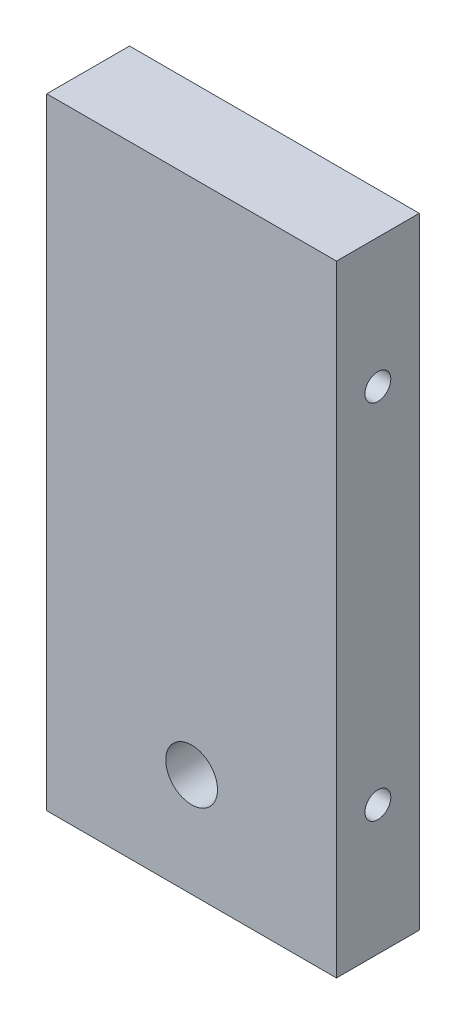
ISO-10303-21;
HEADER;
FILE_DESCRIPTION(('STEP AP214'),'2;1');
FILE_NAME('part.step','',(''),(''),'','','');
FILE_SCHEMA(('AUTOMOTIVE_DESIGN { 1 0 10303 214 1 1 1 1 }'));
ENDSEC;
DATA;
#1=APPLICATION_CONTEXT('core data for automotive mechanical design processes');
#2=APPLICATION_PROTOCOL_DEFINITION('international standard','automotive_design',2000,#1);
#3=PRODUCT_CONTEXT('',#1,'mechanical');
#4=PRODUCT('Part','Part','',(#3));
#5=PRODUCT_RELATED_PRODUCT_CATEGORY('part','',(#4));
#6=PRODUCT_DEFINITION_FORMATION('','',#4);
#7=PRODUCT_DEFINITION_CONTEXT('part definition',#1,'design');
#8=PRODUCT_DEFINITION('design','',#6,#7);
#9=PRODUCT_DEFINITION_SHAPE('','',#8);
#10=(LENGTH_UNIT() NAMED_UNIT(*) SI_UNIT(.MILLI.,.METRE.));
#11=(NAMED_UNIT(*) PLANE_ANGLE_UNIT() SI_UNIT($,.RADIAN.));
#12=(NAMED_UNIT(*) SI_UNIT($,.STERADIAN.) SOLID_ANGLE_UNIT());
#13=UNCERTAINTY_MEASURE_WITH_UNIT(LENGTH_MEASURE(1.E-05),#10,'distance_accuracy_value','');
#14=(GEOMETRIC_REPRESENTATION_CONTEXT(3) GLOBAL_UNCERTAINTY_ASSIGNED_CONTEXT((#13)) GLOBAL_UNIT_ASSIGNED_CONTEXT((#10,
#11,#12)) REPRESENTATION_CONTEXT('',''));
#15=CARTESIAN_POINT('',(0.,0.,0.));
#16=DIRECTION('',(0.,0.,1.));
#17=DIRECTION('',(1.,0.,0.));
#18=AXIS2_PLACEMENT_3D('',#15,#16,#17);
#19=CARTESIAN_POINT('',(0.,0.,8.));
#20=DIRECTION('',(1.,0.,0.));
#21=DIRECTION('',(0.,0.,-1.));
#22=AXIS2_PLACEMENT_3D('',#19,#20,#21);
#23=PLANE('',#22);
#24=CARTESIAN_POINT('',(0.,47.5,4.));
#25=DIRECTION('',(-1.,0.,0.));
#26=DIRECTION('',(0.,0.,1.));
#27=AXIS2_PLACEMENT_3D('',#24,#25,#26);
#28=CIRCLE('',#27,1.25);
#29=CARTESIAN_POINT('',(0.,47.5,5.25));
#30=VERTEX_POINT('',#29);
#31=EDGE_CURVE('E126',#30,#30,#28,.T.);
#32=ORIENTED_EDGE('',*,*,#31,.F.);
#33=EDGE_LOOP('',(#32));
#34=FACE_BOUND('',#33,.T.);
#35=CARTESIAN_POINT('',(0.,12.5,4.));
#36=DIRECTION('',(-1.,0.,0.));
#37=DIRECTION('',(0.,0.,1.));
#38=AXIS2_PLACEMENT_3D('',#35,#36,#37);
#39=CIRCLE('',#38,1.25);
#40=CARTESIAN_POINT('',(0.,12.5,5.25));
#41=VERTEX_POINT('',#40);
#42=EDGE_CURVE('E132',#41,#41,#39,.T.);
#43=ORIENTED_EDGE('',*,*,#42,.F.);
#44=EDGE_LOOP('',(#43));
#45=FACE_BOUND('',#44,.T.);
#46=DIRECTION('',(0.,-1.,0.));
#47=VECTOR('',#46,1.);
#48=CARTESIAN_POINT('',(0.,0.,0.));
#49=LINE('',#48,#47);
#50=CARTESIAN_POINT('',(0.,60.,0.));
#51=VERTEX_POINT('',#50);
#52=CARTESIAN_POINT('',(0.,0.,0.));
#53=VERTEX_POINT('',#52);
#54=EDGE_CURVE('E142',#51,#53,#49,.T.);
#55=ORIENTED_EDGE('',*,*,#54,.T.);
#56=DIRECTION('',(0.,0.,-1.));
#57=VECTOR('',#56,1.);
#58=CARTESIAN_POINT('',(0.,0.,8.));
#59=LINE('',#58,#57);
#60=CARTESIAN_POINT('',(0.,0.,8.));
#61=VERTEX_POINT('',#60);
#62=EDGE_CURVE('E11',#61,#53,#59,.T.);
#63=ORIENTED_EDGE('',*,*,#62,.F.);
#64=DIRECTION('',(0.,-1.,0.));
#65=VECTOR('',#64,1.);
#66=CARTESIAN_POINT('',(0.,0.,8.));
#67=LINE('',#66,#65);
#68=CARTESIAN_POINT('',(0.,60.,8.));
#69=VERTEX_POINT('',#68);
#70=EDGE_CURVE('E145',#69,#61,#67,.T.);
#71=ORIENTED_EDGE('',*,*,#70,.F.);
#72=DIRECTION('',(0.,0.,-1.));
#73=VECTOR('',#72,1.);
#74=CARTESIAN_POINT('',(0.,60.,8.));
#75=LINE('',#74,#73);
#76=EDGE_CURVE('E151',#69,#51,#75,.T.);
#77=ORIENTED_EDGE('',*,*,#76,.T.);
#78=EDGE_LOOP('',(#55,#63,#71,#77));
#79=FACE_BOUND('',#78,.T.);
#80=ADVANCED_FACE('F45',(#34,#45,#79),#23,.F.);
#81=CARTESIAN_POINT('',(0.,0.,8.));
#82=DIRECTION('',(0.,1.,0.));
#83=DIRECTION('',(0.,0.,1.));
#84=AXIS2_PLACEMENT_3D('',#81,#82,#83);
#85=PLANE('',#84);
#86=DIRECTION('',(1.,0.,0.));
#87=VECTOR('',#86,1.);
#88=CARTESIAN_POINT('',(0.,0.,0.));
#89=LINE('',#88,#87);
#90=CARTESIAN_POINT('',(28.,0.,0.));
#91=VERTEX_POINT('',#90);
#92=EDGE_CURVE('E154',#53,#91,#89,.T.);
#93=ORIENTED_EDGE('',*,*,#92,.T.);
#94=DIRECTION('',(0.,0.,-1.));
#95=VECTOR('',#94,1.);
#96=CARTESIAN_POINT('',(28.,0.,8.));
#97=LINE('',#96,#95);
#98=CARTESIAN_POINT('',(28.,0.,8.));
#99=VERTEX_POINT('',#98);
#100=EDGE_CURVE('E53',#99,#91,#97,.T.);
#101=ORIENTED_EDGE('',*,*,#100,.F.);
#102=DIRECTION('',(1.,0.,0.));
#103=VECTOR('',#102,1.);
#104=CARTESIAN_POINT('',(0.,0.,8.));
#105=LINE('',#104,#103);
#106=EDGE_CURVE('E92',#61,#99,#105,.T.);
#107=ORIENTED_EDGE('',*,*,#106,.F.);
#108=ORIENTED_EDGE('',*,*,#62,.T.);
#109=EDGE_LOOP('',(#93,#101,#107,#108));
#110=FACE_BOUND('',#109,.T.);
#111=ADVANCED_FACE('F179',(#110),#85,.F.);
#112=CARTESIAN_POINT('',(28.,0.,8.));
#113=DIRECTION('',(-1.,0.,0.));
#114=DIRECTION('',(0.,0.,1.));
#115=AXIS2_PLACEMENT_3D('',#112,#113,#114);
#116=PLANE('',#115);
#117=CARTESIAN_POINT('',(28.,47.5,4.));
#118=DIRECTION('',(1.,0.,0.));
#119=DIRECTION('',(0.,0.,-1.));
#120=AXIS2_PLACEMENT_3D('',#117,#118,#119);
#121=CIRCLE('',#120,1.25);
#122=CARTESIAN_POINT('',(28.,47.5,2.75));
#123=VERTEX_POINT('',#122);
#124=EDGE_CURVE('E116',#123,#123,#121,.T.);
#125=ORIENTED_EDGE('',*,*,#124,.F.);
#126=EDGE_LOOP('',(#125));
#127=FACE_BOUND('',#126,.T.);
#128=CARTESIAN_POINT('',(28.,12.5,4.));
#129=DIRECTION('',(1.,0.,0.));
#130=DIRECTION('',(0.,0.,-1.));
#131=AXIS2_PLACEMENT_3D('',#128,#129,#130);
#132=CIRCLE('',#131,1.25);
#133=CARTESIAN_POINT('',(28.,12.5,2.75));
#134=VERTEX_POINT('',#133);
#135=EDGE_CURVE('E115',#134,#134,#132,.T.);
#136=ORIENTED_EDGE('',*,*,#135,.F.);
#137=EDGE_LOOP('',(#136));
#138=FACE_BOUND('',#137,.T.);
#139=DIRECTION('',(0.,1.,0.));
#140=VECTOR('',#139,1.);
#141=CARTESIAN_POINT('',(28.,0.,0.));
#142=LINE('',#141,#140);
#143=CARTESIAN_POINT('',(28.,60.,0.));
#144=VERTEX_POINT('',#143);
#145=EDGE_CURVE('E79',#91,#144,#142,.T.);
#146=ORIENTED_EDGE('',*,*,#145,.T.);
#147=DIRECTION('',(0.,0.,-1.));
#148=VECTOR('',#147,1.);
#149=CARTESIAN_POINT('',(28.,60.,8.));
#150=LINE('',#149,#148);
#151=CARTESIAN_POINT('',(28.,60.,8.));
#152=VERTEX_POINT('',#151);
#153=EDGE_CURVE('E159',#152,#144,#150,.T.);
#154=ORIENTED_EDGE('',*,*,#153,.F.);
#155=DIRECTION('',(0.,1.,0.));
#156=VECTOR('',#155,1.);
#157=CARTESIAN_POINT('',(28.,0.,8.));
#158=LINE('',#157,#156);
#159=EDGE_CURVE('E148',#99,#152,#158,.T.);
#160=ORIENTED_EDGE('',*,*,#159,.F.);
#161=ORIENTED_EDGE('',*,*,#100,.T.);
#162=EDGE_LOOP('',(#146,#154,#160,#161));
#163=FACE_BOUND('',#162,.T.);
#164=ADVANCED_FACE('F161',(#127,#138,#163),#116,.F.);
#165=CARTESIAN_POINT('',(0.,60.,8.));
#166=DIRECTION('',(0.,-1.,0.));
#167=DIRECTION('',(0.,0.,-1.));
#168=AXIS2_PLACEMENT_3D('',#165,#166,#167);
#169=PLANE('',#168);
#170=DIRECTION('',(-1.,0.,0.));
#171=VECTOR('',#170,1.);
#172=CARTESIAN_POINT('',(0.,60.,0.));
#173=LINE('',#172,#171);
#174=EDGE_CURVE('E85',#144,#51,#173,.T.);
#175=ORIENTED_EDGE('',*,*,#174,.T.);
#176=ORIENTED_EDGE('',*,*,#76,.F.);
#177=DIRECTION('',(-1.,0.,0.));
#178=VECTOR('',#177,1.);
#179=CARTESIAN_POINT('',(0.,60.,8.));
#180=LINE('',#179,#178);
#181=EDGE_CURVE('E61',#152,#69,#180,.T.);
#182=ORIENTED_EDGE('',*,*,#181,.F.);
#183=ORIENTED_EDGE('',*,*,#153,.T.);
#184=EDGE_LOOP('',(#175,#176,#182,#183));
#185=FACE_BOUND('',#184,.T.);
#186=ADVANCED_FACE('F168',(#185),#169,.F.);
#187=CARTESIAN_POINT('',(0.,0.,8.));
#188=DIRECTION('',(0.,0.,-1.));
#189=DIRECTION('',(-1.,0.,0.));
#190=AXIS2_PLACEMENT_3D('',#187,#188,#189);
#191=PLANE('',#190);
#192=CARTESIAN_POINT('',(14.,10.,8.));
#193=DIRECTION('',(0.,0.,1.));
#194=DIRECTION('',(1.,0.,0.));
#195=AXIS2_PLACEMENT_3D('',#192,#193,#194);
#196=CIRCLE('',#195,2.5);
#197=CARTESIAN_POINT('',(16.5,10.,8.));
#198=VERTEX_POINT('',#197);
#199=EDGE_CURVE('E138',#198,#198,#196,.T.);
#200=ORIENTED_EDGE('',*,*,#199,.F.);
#201=EDGE_LOOP('',(#200));
#202=FACE_BOUND('',#201,.T.);
#203=ORIENTED_EDGE('',*,*,#70,.T.);
#204=ORIENTED_EDGE('',*,*,#106,.T.);
#205=ORIENTED_EDGE('',*,*,#159,.T.);
#206=ORIENTED_EDGE('',*,*,#181,.T.);
#207=EDGE_LOOP('',(#203,#204,#205,#206));
#208=FACE_BOUND('',#207,.T.);
#209=ADVANCED_FACE('F170',(#202,#208),#191,.F.);
#210=CARTESIAN_POINT('',(0.,0.,0.));
#211=DIRECTION('',(0.,0.,-1.));
#212=DIRECTION('',(-1.,0.,0.));
#213=AXIS2_PLACEMENT_3D('',#210,#211,#212);
#214=PLANE('',#213);
#215=CARTESIAN_POINT('',(14.,10.,0.));
#216=DIRECTION('',(0.,0.,1.));
#217=DIRECTION('',(1.,0.,0.));
#218=AXIS2_PLACEMENT_3D('',#215,#216,#217);
#219=CIRCLE('',#218,2.5);
#220=CARTESIAN_POINT('',(16.5,10.,0.));
#221=VERTEX_POINT('',#220);
#222=EDGE_CURVE('E139',#221,#221,#219,.T.);
#223=ORIENTED_EDGE('',*,*,#222,.T.);
#224=EDGE_LOOP('',(#223));
#225=FACE_BOUND('',#224,.T.);
#226=ORIENTED_EDGE('',*,*,#54,.F.);
#227=ORIENTED_EDGE('',*,*,#174,.F.);
#228=ORIENTED_EDGE('',*,*,#145,.F.);
#229=ORIENTED_EDGE('',*,*,#92,.F.);
#230=EDGE_LOOP('',(#226,#227,#228,#229));
#231=FACE_BOUND('',#230,.T.);
#232=ADVANCED_FACE('F164',(#225,#231),#214,.T.);
#233=CARTESIAN_POINT('',(14.,10.,0.));
#234=DIRECTION('',(0.,0.,1.));
#235=DIRECTION('',(1.,0.,0.));
#236=AXIS2_PLACEMENT_3D('',#233,#234,#235);
#237=CYLINDRICAL_SURFACE('',#236,2.5);
#238=ORIENTED_EDGE('',*,*,#222,.F.);
#239=EDGE_LOOP('',(#238));
#240=FACE_BOUND('',#239,.T.);
#241=ORIENTED_EDGE('',*,*,#199,.T.);
#242=EDGE_LOOP('',(#241));
#243=FACE_BOUND('',#242,.T.);
#244=ADVANCED_FACE('F205',(#240,#243),#237,.F.);
#245=CARTESIAN_POINT('',(7.5,12.5,4.));
#246=DIRECTION('',(-1.,0.,0.));
#247=DIRECTION('',(0.,0.,1.));
#248=AXIS2_PLACEMENT_3D('',#245,#246,#247);
#249=CONICAL_SURFACE('',#248,1.25,1.02974425867665);
#250=CARTESIAN_POINT('',(8.25107577378445,12.5,4.));
#251=VERTEX_POINT('',#250);
#252=VERTEX_LOOP('',#251);
#253=FACE_BOUND('',#252,.T.);
#254=CARTESIAN_POINT('',(7.5,12.5,4.));
#255=DIRECTION('',(-1.,0.,0.));
#256=DIRECTION('',(0.,0.,1.));
#257=AXIS2_PLACEMENT_3D('',#254,#255,#256);
#258=CIRCLE('',#257,1.25);
#259=CARTESIAN_POINT('',(7.5,12.5,5.25));
#260=VERTEX_POINT('',#259);
#261=EDGE_CURVE('E135',#260,#260,#258,.T.);
#262=ORIENTED_EDGE('',*,*,#261,.T.);
#263=EDGE_LOOP('',(#262));
#264=FACE_BOUND('',#263,.T.);
#265=ADVANCED_FACE('F194',(#253,#264),#249,.F.);
#266=CARTESIAN_POINT('',(0.,12.5,4.));
#267=DIRECTION('',(-1.,0.,0.));
#268=DIRECTION('',(0.,0.,1.));
#269=AXIS2_PLACEMENT_3D('',#266,#267,#268);
#270=CYLINDRICAL_SURFACE('',#269,1.25);
#271=ORIENTED_EDGE('',*,*,#261,.F.);
#272=EDGE_LOOP('',(#271));
#273=FACE_BOUND('',#272,.T.);
#274=ORIENTED_EDGE('',*,*,#42,.T.);
#275=EDGE_LOOP('',(#274));
#276=FACE_BOUND('',#275,.T.);
#277=ADVANCED_FACE('F192',(#273,#276),#270,.F.);
#278=CARTESIAN_POINT('',(7.5,47.5,4.));
#279=DIRECTION('',(-1.,0.,0.));
#280=DIRECTION('',(0.,0.,1.));
#281=AXIS2_PLACEMENT_3D('',#278,#279,#280);
#282=CONICAL_SURFACE('',#281,1.25,1.02974425867665);
#283=CARTESIAN_POINT('',(8.25107577378445,47.5,4.));
#284=VERTEX_POINT('',#283);
#285=VERTEX_LOOP('',#284);
#286=FACE_BOUND('',#285,.T.);
#287=CARTESIAN_POINT('',(7.5,47.5,4.));
#288=DIRECTION('',(-1.,0.,0.));
#289=DIRECTION('',(0.,0.,1.));
#290=AXIS2_PLACEMENT_3D('',#287,#288,#289);
#291=CIRCLE('',#290,1.25);
#292=CARTESIAN_POINT('',(7.5,47.5,5.25));
#293=VERTEX_POINT('',#292);
#294=EDGE_CURVE('E129',#293,#293,#291,.T.);
#295=ORIENTED_EDGE('',*,*,#294,.T.);
#296=EDGE_LOOP('',(#295));
#297=FACE_BOUND('',#296,.T.);
#298=ADVANCED_FACE('F193',(#286,#297),#282,.F.);
#299=CARTESIAN_POINT('',(0.,47.5,4.));
#300=DIRECTION('',(-1.,0.,0.));
#301=DIRECTION('',(0.,0.,1.));
#302=AXIS2_PLACEMENT_3D('',#299,#300,#301);
#303=CYLINDRICAL_SURFACE('',#302,1.25);
#304=ORIENTED_EDGE('',*,*,#294,.F.);
#305=EDGE_LOOP('',(#304));
#306=FACE_BOUND('',#305,.T.);
#307=ORIENTED_EDGE('',*,*,#31,.T.);
#308=EDGE_LOOP('',(#307));
#309=FACE_BOUND('',#308,.T.);
#310=ADVANCED_FACE('F201',(#306,#309),#303,.F.);
#311=CARTESIAN_POINT('',(20.5,12.5,4.));
#312=DIRECTION('',(1.,0.,0.));
#313=DIRECTION('',(0.,0.,-1.));
#314=AXIS2_PLACEMENT_3D('',#311,#312,#313);
#315=CONICAL_SURFACE('',#314,1.25,1.02974425867665);
#316=CARTESIAN_POINT('',(19.7489242262155,12.5,4.));
#317=VERTEX_POINT('',#316);
#318=VERTEX_LOOP('',#317);
#319=FACE_BOUND('',#318,.T.);
#320=CARTESIAN_POINT('',(20.5,12.5,4.));
#321=DIRECTION('',(1.,0.,0.));
#322=DIRECTION('',(0.,0.,-1.));
#323=AXIS2_PLACEMENT_3D('',#320,#321,#322);
#324=CIRCLE('',#323,1.25);
#325=CARTESIAN_POINT('',(20.5,12.5,2.75));
#326=VERTEX_POINT('',#325);
#327=EDGE_CURVE('E119',#326,#326,#324,.T.);
#328=ORIENTED_EDGE('',*,*,#327,.T.);
#329=EDGE_LOOP('',(#328));
#330=FACE_BOUND('',#329,.T.);
#331=ADVANCED_FACE('F264',(#319,#330),#315,.F.);
#332=CARTESIAN_POINT('',(28.,12.5,4.));
#333=DIRECTION('',(1.,0.,0.));
#334=DIRECTION('',(0.,0.,-1.));
#335=AXIS2_PLACEMENT_3D('',#332,#333,#334);
#336=CYLINDRICAL_SURFACE('',#335,1.25);
#337=ORIENTED_EDGE('',*,*,#327,.F.);
#338=EDGE_LOOP('',(#337));
#339=FACE_BOUND('',#338,.T.);
#340=ORIENTED_EDGE('',*,*,#135,.T.);
#341=EDGE_LOOP('',(#340));
#342=FACE_BOUND('',#341,.T.);
#343=ADVANCED_FACE('F109',(#339,#342),#336,.F.);
#344=CARTESIAN_POINT('',(20.5,47.5,4.));
#345=DIRECTION('',(1.,0.,0.));
#346=DIRECTION('',(0.,0.,-1.));
#347=AXIS2_PLACEMENT_3D('',#344,#345,#346);
#348=CONICAL_SURFACE('',#347,1.25,1.02974425867665);
#349=CARTESIAN_POINT('',(19.7489242262155,47.5,4.));
#350=VERTEX_POINT('',#349);
#351=VERTEX_LOOP('',#350);
#352=FACE_BOUND('',#351,.T.);
#353=CARTESIAN_POINT('',(20.5,47.5,4.));
#354=DIRECTION('',(1.,0.,0.));
#355=DIRECTION('',(0.,0.,-1.));
#356=AXIS2_PLACEMENT_3D('',#353,#354,#355);
#357=CIRCLE('',#356,1.25);
#358=CARTESIAN_POINT('',(20.5,47.5,2.75));
#359=VERTEX_POINT('',#358);
#360=EDGE_CURVE('E113',#359,#359,#357,.T.);
#361=ORIENTED_EDGE('',*,*,#360,.T.);
#362=EDGE_LOOP('',(#361));
#363=FACE_BOUND('',#362,.T.);
#364=ADVANCED_FACE('F105',(#352,#363),#348,.F.);
#365=CARTESIAN_POINT('',(28.,47.5,4.));
#366=DIRECTION('',(1.,0.,0.));
#367=DIRECTION('',(0.,0.,-1.));
#368=AXIS2_PLACEMENT_3D('',#365,#366,#367);
#369=CYLINDRICAL_SURFACE('',#368,1.25);
#370=ORIENTED_EDGE('',*,*,#360,.F.);
#371=EDGE_LOOP('',(#370));
#372=FACE_BOUND('',#371,.T.);
#373=ORIENTED_EDGE('',*,*,#124,.T.);
#374=EDGE_LOOP('',(#373));
#375=FACE_BOUND('',#374,.T.);
#376=ADVANCED_FACE('F108',(#372,#375),#369,.F.);
#377=CLOSED_SHELL('',(#80,#111,#164,#186,#209,#232,#244,#265,#277,#298,#310,#331,#343,#364,#376));
#378=MANIFOLD_SOLID_BREP('B2',#377);
#379=ADVANCED_BREP_SHAPE_REPRESENTATION('',(#18,#378),#14);
#380=SHAPE_DEFINITION_REPRESENTATION(#9,#379);
ENDSEC;
END-ISO-10303-21;
